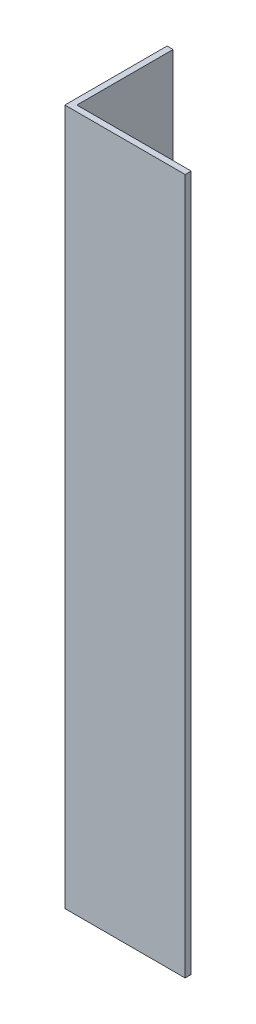
ISO-10303-21;
HEADER;
FILE_DESCRIPTION(('STEP AP214'),'2;1');
FILE_NAME('part.step','',(''),(''),'','','');
FILE_SCHEMA(('AUTOMOTIVE_DESIGN { 1 0 10303 214 1 1 1 1 }'));
ENDSEC;
DATA;
#1=APPLICATION_CONTEXT('core data for automotive mechanical design processes');
#2=APPLICATION_PROTOCOL_DEFINITION('international standard','automotive_design',2000,#1);
#3=PRODUCT_CONTEXT('',#1,'mechanical');
#4=PRODUCT('Part','Part','',(#3));
#5=PRODUCT_RELATED_PRODUCT_CATEGORY('part','',(#4));
#6=PRODUCT_DEFINITION_FORMATION('','',#4);
#7=PRODUCT_DEFINITION_CONTEXT('part definition',#1,'design');
#8=PRODUCT_DEFINITION('design','',#6,#7);
#9=PRODUCT_DEFINITION_SHAPE('','',#8);
#10=(LENGTH_UNIT() NAMED_UNIT(*) SI_UNIT(.MILLI.,.METRE.));
#11=(NAMED_UNIT(*) PLANE_ANGLE_UNIT() SI_UNIT($,.RADIAN.));
#12=(NAMED_UNIT(*) SI_UNIT($,.STERADIAN.) SOLID_ANGLE_UNIT());
#13=UNCERTAINTY_MEASURE_WITH_UNIT(LENGTH_MEASURE(1.E-05),#10,'distance_accuracy_value','');
#14=(GEOMETRIC_REPRESENTATION_CONTEXT(3) GLOBAL_UNCERTAINTY_ASSIGNED_CONTEXT((#13)) GLOBAL_UNIT_ASSIGNED_CONTEXT((#10,
#11,#12)) REPRESENTATION_CONTEXT('',''));
#15=CARTESIAN_POINT('',(0.,0.,0.));
#16=DIRECTION('',(0.,0.,1.));
#17=DIRECTION('',(1.,0.,0.));
#18=AXIS2_PLACEMENT_3D('',#15,#16,#17);
#19=CARTESIAN_POINT('',(-400.05,457.2,107.95));
#20=DIRECTION('',(-1.,0.,0.));
#21=DIRECTION('',(0.,-1.,0.));
#22=AXIS2_PLACEMENT_3D('',#19,#20,#21);
#23=PLANE('',#22);
#24=DIRECTION('',(0.,1.,0.));
#25=VECTOR('',#24,1.);
#26=CARTESIAN_POINT('',(-400.05,457.2,101.6));
#27=LINE('',#26,#25);
#28=CARTESIAN_POINT('',(-400.05,-277.541844670854,101.6));
#29=VERTEX_POINT('',#28);
#30=CARTESIAN_POINT('',(-400.05,457.2,101.6));
#31=VERTEX_POINT('',#30);
#32=EDGE_CURVE('E54',#29,#31,#27,.T.);
#33=ORIENTED_EDGE('',*,*,#32,.F.);
#34=DIRECTION('',(0.,0.,-1.));
#35=VECTOR('',#34,1.);
#36=CARTESIAN_POINT('',(-400.05,-277.541844670854,107.95));
#37=LINE('',#36,#35);
#38=CARTESIAN_POINT('',(-400.05,-277.541844670854,0.));
#39=VERTEX_POINT('',#38);
#40=EDGE_CURVE('E47',#29,#39,#37,.T.);
#41=ORIENTED_EDGE('',*,*,#40,.T.);
#42=DIRECTION('',(0.,1.,0.));
#43=VECTOR('',#42,1.);
#44=CARTESIAN_POINT('',(-400.05,457.2,0.));
#45=LINE('',#44,#43);
#46=CARTESIAN_POINT('',(-400.05,457.2,0.));
#47=VERTEX_POINT('',#46);
#48=EDGE_CURVE('E93',#39,#47,#45,.T.);
#49=ORIENTED_EDGE('',*,*,#48,.T.);
#50=DIRECTION('',(0.,0.,-1.));
#51=VECTOR('',#50,1.);
#52=CARTESIAN_POINT('',(-400.05,457.2,107.95));
#53=LINE('',#52,#51);
#54=EDGE_CURVE('E87',#31,#47,#53,.T.);
#55=ORIENTED_EDGE('',*,*,#54,.F.);
#56=EDGE_LOOP('',(#33,#41,#49,#55));
#57=FACE_BOUND('',#56,.T.);
#58=ADVANCED_FACE('F39',(#57),#23,.F.);
#59=CARTESIAN_POINT('',(-406.4,457.2,107.95));
#60=DIRECTION('',(1.,0.,0.));
#61=DIRECTION('',(0.,1.,0.));
#62=AXIS2_PLACEMENT_3D('',#59,#60,#61);
#63=PLANE('',#62);
#64=DIRECTION('',(0.,-1.,0.));
#65=VECTOR('',#64,1.);
#66=CARTESIAN_POINT('',(-406.4,457.2,0.));
#67=LINE('',#66,#65);
#68=CARTESIAN_POINT('',(-406.4,457.2,0.));
#69=VERTEX_POINT('',#68);
#70=CARTESIAN_POINT('',(-406.400000000003,-277.541844670853,0.));
#71=VERTEX_POINT('',#70);
#72=EDGE_CURVE('E98',#69,#71,#67,.T.);
#73=ORIENTED_EDGE('',*,*,#72,.T.);
#74=DIRECTION('',(0.,0.,-1.));
#75=VECTOR('',#74,1.);
#76=CARTESIAN_POINT('',(-406.400000000003,-277.541844670853,107.95));
#77=LINE('',#76,#75);
#78=CARTESIAN_POINT('',(-406.400000000003,-277.541844670853,107.95));
#79=VERTEX_POINT('',#78);
#80=EDGE_CURVE('E11',#79,#71,#77,.T.);
#81=ORIENTED_EDGE('',*,*,#80,.F.);
#82=DIRECTION('',(0.,-1.,0.));
#83=VECTOR('',#82,1.);
#84=CARTESIAN_POINT('',(-406.4,457.2,107.95));
#85=LINE('',#84,#83);
#86=CARTESIAN_POINT('',(-406.4,457.2,107.95));
#87=VERTEX_POINT('',#86);
#88=EDGE_CURVE('E92',#87,#79,#85,.T.);
#89=ORIENTED_EDGE('',*,*,#88,.F.);
#90=DIRECTION('',(0.,0.,-1.));
#91=VECTOR('',#90,1.);
#92=CARTESIAN_POINT('',(-406.4,457.2,107.95));
#93=LINE('',#92,#91);
#94=EDGE_CURVE('E84',#87,#69,#93,.T.);
#95=ORIENTED_EDGE('',*,*,#94,.T.);
#96=EDGE_LOOP('',(#73,#81,#89,#95));
#97=FACE_BOUND('',#96,.T.);
#98=ADVANCED_FACE('F41',(#97),#63,.F.);
#99=CARTESIAN_POINT('',(-406.400000000003,-277.541844670853,107.95));
#100=DIRECTION('',(0.,1.,0.));
#101=DIRECTION('',(-1.,0.,0.));
#102=AXIS2_PLACEMENT_3D('',#99,#100,#101);
#103=PLANE('',#102);
#104=DIRECTION('',(1.,0.,0.));
#105=VECTOR('',#104,1.);
#106=CARTESIAN_POINT('',(-406.400000000003,-277.541844670853,0.));
#107=LINE('',#106,#105);
#108=EDGE_CURVE('E102',#71,#39,#107,.T.);
#109=ORIENTED_EDGE('',*,*,#108,.T.);
#110=ORIENTED_EDGE('',*,*,#40,.F.);
#111=DIRECTION('',(-1.,0.,0.));
#112=VECTOR('',#111,1.);
#113=CARTESIAN_POINT('',(-279.4,-277.541844670854,101.6));
#114=LINE('',#113,#112);
#115=CARTESIAN_POINT('',(-279.4,-277.541844670854,101.6));
#116=VERTEX_POINT('',#115);
#117=EDGE_CURVE('E103',#116,#29,#114,.T.);
#118=ORIENTED_EDGE('',*,*,#117,.F.);
#119=DIRECTION('',(0.,0.,-1.));
#120=VECTOR('',#119,1.);
#121=CARTESIAN_POINT('',(-279.4,-277.541844670854,107.95));
#122=LINE('',#121,#120);
#123=CARTESIAN_POINT('',(-279.4,-277.541844670854,107.95));
#124=VERTEX_POINT('',#123);
#125=EDGE_CURVE('E121',#124,#116,#122,.T.);
#126=ORIENTED_EDGE('',*,*,#125,.F.);
#127=DIRECTION('',(1.,0.,0.));
#128=VECTOR('',#127,1.);
#129=CARTESIAN_POINT('',(-406.400000000003,-277.541844670853,107.95));
#130=LINE('',#129,#128);
#131=EDGE_CURVE('E118',#79,#124,#130,.T.);
#132=ORIENTED_EDGE('',*,*,#131,.F.);
#133=ORIENTED_EDGE('',*,*,#80,.T.);
#134=EDGE_LOOP('',(#109,#110,#118,#126,#132,#133));
#135=FACE_BOUND('',#134,.T.);
#136=ADVANCED_FACE('F115',(#135),#103,.F.);
#137=CARTESIAN_POINT('',(-406.4,457.2,107.95));
#138=DIRECTION('',(0.,-1.,0.));
#139=DIRECTION('',(1.,0.,0.));
#140=AXIS2_PLACEMENT_3D('',#137,#138,#139);
#141=PLANE('',#140);
#142=DIRECTION('',(-1.,0.,0.));
#143=VECTOR('',#142,1.);
#144=CARTESIAN_POINT('',(-406.4,457.2,0.));
#145=LINE('',#144,#143);
#146=EDGE_CURVE('E81',#47,#69,#145,.T.);
#147=ORIENTED_EDGE('',*,*,#146,.T.);
#148=ORIENTED_EDGE('',*,*,#94,.F.);
#149=DIRECTION('',(-1.,0.,0.));
#150=VECTOR('',#149,1.);
#151=CARTESIAN_POINT('',(-406.4,457.2,107.95));
#152=LINE('',#151,#150);
#153=CARTESIAN_POINT('',(-279.4,457.2,107.95));
#154=VERTEX_POINT('',#153);
#155=EDGE_CURVE('E63',#154,#87,#152,.T.);
#156=ORIENTED_EDGE('',*,*,#155,.F.);
#157=DIRECTION('',(0.,0.,1.));
#158=VECTOR('',#157,1.);
#159=CARTESIAN_POINT('',(-279.4,457.2,107.95));
#160=LINE('',#159,#158);
#161=CARTESIAN_POINT('',(-279.4,457.2,101.6));
#162=VERTEX_POINT('',#161);
#163=EDGE_CURVE('E127',#162,#154,#160,.T.);
#164=ORIENTED_EDGE('',*,*,#163,.F.);
#165=DIRECTION('',(-1.,0.,0.));
#166=VECTOR('',#165,1.);
#167=CARTESIAN_POINT('',(-279.4,457.2,101.6));
#168=LINE('',#167,#166);
#169=EDGE_CURVE('E107',#162,#31,#168,.T.);
#170=ORIENTED_EDGE('',*,*,#169,.T.);
#171=ORIENTED_EDGE('',*,*,#54,.T.);
#172=EDGE_LOOP('',(#147,#148,#156,#164,#170,#171));
#173=FACE_BOUND('',#172,.T.);
#174=ADVANCED_FACE('F83',(#173),#141,.F.);
#175=CARTESIAN_POINT('',(0.,0.,107.95));
#176=DIRECTION('',(0.,0.,1.));
#177=DIRECTION('',(1.,0.,0.));
#178=AXIS2_PLACEMENT_3D('',#175,#176,#177);
#179=PLANE('',#178);
#180=ORIENTED_EDGE('',*,*,#88,.T.);
#181=ORIENTED_EDGE('',*,*,#131,.T.);
#182=DIRECTION('',(0.,-1.,0.));
#183=VECTOR('',#182,1.);
#184=CARTESIAN_POINT('',(-279.4,457.2,107.95));
#185=LINE('',#184,#183);
#186=EDGE_CURVE('E129',#154,#124,#185,.T.);
#187=ORIENTED_EDGE('',*,*,#186,.F.);
#188=ORIENTED_EDGE('',*,*,#155,.T.);
#189=EDGE_LOOP('',(#180,#181,#187,#188));
#190=FACE_BOUND('',#189,.T.);
#191=ADVANCED_FACE('F123',(#190),#179,.T.);
#192=CARTESIAN_POINT('',(0.,0.,0.));
#193=DIRECTION('',(0.,0.,1.));
#194=DIRECTION('',(1.,0.,0.));
#195=AXIS2_PLACEMENT_3D('',#192,#193,#194);
#196=PLANE('',#195);
#197=ORIENTED_EDGE('',*,*,#72,.F.);
#198=ORIENTED_EDGE('',*,*,#146,.F.);
#199=ORIENTED_EDGE('',*,*,#48,.F.);
#200=ORIENTED_EDGE('',*,*,#108,.F.);
#201=EDGE_LOOP('',(#197,#198,#199,#200));
#202=FACE_BOUND('',#201,.T.);
#203=ADVANCED_FACE('F100',(#202),#196,.F.);
#204=CARTESIAN_POINT('',(-279.4,457.2,101.6));
#205=DIRECTION('',(0.,0.,1.));
#206=DIRECTION('',(0.,-1.,0.));
#207=AXIS2_PLACEMENT_3D('',#204,#205,#206);
#208=PLANE('',#207);
#209=ORIENTED_EDGE('',*,*,#32,.T.);
#210=ORIENTED_EDGE('',*,*,#169,.F.);
#211=DIRECTION('',(0.,1.,0.));
#212=VECTOR('',#211,1.);
#213=CARTESIAN_POINT('',(-279.4,457.2,101.6));
#214=LINE('',#213,#212);
#215=EDGE_CURVE('E132',#116,#162,#214,.T.);
#216=ORIENTED_EDGE('',*,*,#215,.F.);
#217=ORIENTED_EDGE('',*,*,#117,.T.);
#218=EDGE_LOOP('',(#209,#210,#216,#217));
#219=FACE_BOUND('',#218,.T.);
#220=ADVANCED_FACE('F148',(#219),#208,.F.);
#221=CARTESIAN_POINT('',(-279.4,0.,0.));
#222=DIRECTION('',(1.,0.,0.));
#223=DIRECTION('',(0.,1.,0.));
#224=AXIS2_PLACEMENT_3D('',#221,#222,#223);
#225=PLANE('',#224);
#226=ORIENTED_EDGE('',*,*,#186,.T.);
#227=ORIENTED_EDGE('',*,*,#125,.T.);
#228=ORIENTED_EDGE('',*,*,#215,.T.);
#229=ORIENTED_EDGE('',*,*,#163,.T.);
#230=EDGE_LOOP('',(#226,#227,#228,#229));
#231=FACE_BOUND('',#230,.T.);
#232=ADVANCED_FACE('F137',(#231),#225,.T.);
#233=CLOSED_SHELL('',(#58,#98,#136,#174,#191,#203,#220,#232));
#234=MANIFOLD_SOLID_BREP('B2',#233);
#235=ADVANCED_BREP_SHAPE_REPRESENTATION('',(#18,#234),#14);
#236=SHAPE_DEFINITION_REPRESENTATION(#9,#235);
ENDSEC;
END-ISO-10303-21;
